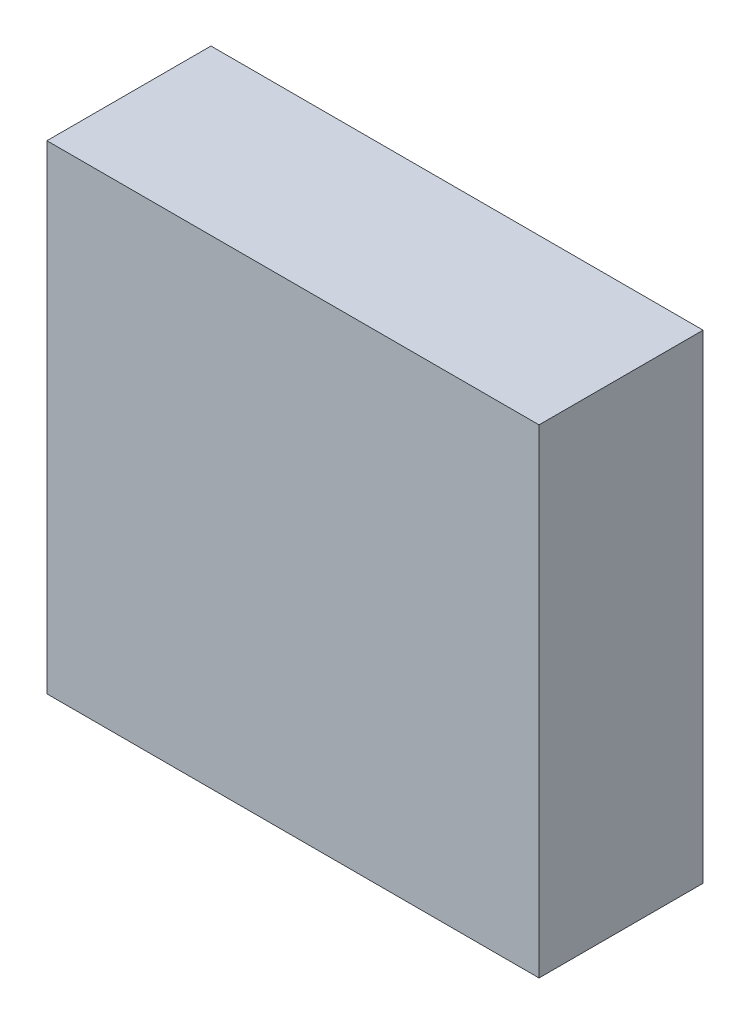
ISO-10303-21;
HEADER;
FILE_DESCRIPTION(('STEP AP214'),'2;1');
FILE_NAME('part.step','',(''),(''),'','','');
FILE_SCHEMA(('AUTOMOTIVE_DESIGN { 1 0 10303 214 1 1 1 1 }'));
ENDSEC;
DATA;
#1=APPLICATION_CONTEXT('core data for automotive mechanical design processes');
#2=APPLICATION_PROTOCOL_DEFINITION('international standard','automotive_design',2000,#1);
#3=PRODUCT_CONTEXT('',#1,'mechanical');
#4=PRODUCT('Part','Part','',(#3));
#5=PRODUCT_RELATED_PRODUCT_CATEGORY('part','',(#4));
#6=PRODUCT_DEFINITION_FORMATION('','',#4);
#7=PRODUCT_DEFINITION_CONTEXT('part definition',#1,'design');
#8=PRODUCT_DEFINITION('design','',#6,#7);
#9=PRODUCT_DEFINITION_SHAPE('','',#8);
#10=(LENGTH_UNIT() NAMED_UNIT(*) SI_UNIT(.MILLI.,.METRE.));
#11=(NAMED_UNIT(*) PLANE_ANGLE_UNIT() SI_UNIT($,.RADIAN.));
#12=(NAMED_UNIT(*) SI_UNIT($,.STERADIAN.) SOLID_ANGLE_UNIT());
#13=UNCERTAINTY_MEASURE_WITH_UNIT(LENGTH_MEASURE(1.E-05),#10,'distance_accuracy_value','');
#14=(GEOMETRIC_REPRESENTATION_CONTEXT(3) GLOBAL_UNCERTAINTY_ASSIGNED_CONTEXT((#13)) GLOBAL_UNIT_ASSIGNED_CONTEXT((#10,
#11,#12)) REPRESENTATION_CONTEXT('',''));
#15=CARTESIAN_POINT('',(0.,0.,0.));
#16=DIRECTION('',(0.,0.,1.));
#17=DIRECTION('',(1.,0.,0.));
#18=AXIS2_PLACEMENT_3D('',#15,#16,#17);
#19=CARTESIAN_POINT('',(15.113,3.048,1.6));
#20=DIRECTION('',(0.,0.,-1.));
#21=DIRECTION('',(0.,-1.,0.));
#22=AXIS2_PLACEMENT_3D('',#19,#20,#21);
#23=PLANE('',#22);
#24=DIRECTION('',(1.,0.,0.));
#25=VECTOR('',#24,1.);
#26=CARTESIAN_POINT('',(16.613,1.626,1.6));
#27=LINE('',#26,#25);
#28=CARTESIAN_POINT('',(13.613,1.626,1.6));
#29=VERTEX_POINT('',#28);
#30=CARTESIAN_POINT('',(16.613,1.626,1.6));
#31=VERTEX_POINT('',#30);
#32=EDGE_CURVE('E93',#29,#31,#27,.T.);
#33=ORIENTED_EDGE('',*,*,#32,.F.);
#34=DIRECTION('',(0.,-1.,0.));
#35=VECTOR('',#34,1.);
#36=CARTESIAN_POINT('',(13.613,1.626,1.6));
#37=LINE('',#36,#35);
#38=CARTESIAN_POINT('',(13.613,4.5462,1.6));
#39=VERTEX_POINT('',#38);
#40=EDGE_CURVE('E26',#39,#29,#37,.T.);
#41=ORIENTED_EDGE('',*,*,#40,.F.);
#42=DIRECTION('',(-1.,0.,0.));
#43=VECTOR('',#42,1.);
#44=CARTESIAN_POINT('',(13.613,4.5462,1.6));
#45=LINE('',#44,#43);
#46=CARTESIAN_POINT('',(16.613,4.5462,1.6));
#47=VERTEX_POINT('',#46);
#48=EDGE_CURVE('E83',#47,#39,#45,.T.);
#49=ORIENTED_EDGE('',*,*,#48,.F.);
#50=DIRECTION('',(0.,1.,0.));
#51=VECTOR('',#50,1.);
#52=CARTESIAN_POINT('',(16.613,4.5462,1.6));
#53=LINE('',#52,#51);
#54=EDGE_CURVE('E107',#31,#47,#53,.T.);
#55=ORIENTED_EDGE('',*,*,#54,.F.);
#56=EDGE_LOOP('',(#33,#41,#49,#55));
#57=FACE_BOUND('',#56,.T.);
#58=ADVANCED_FACE('F16',(#57),#23,.T.);
#59=CARTESIAN_POINT('',(15.113,3.048,2.6));
#60=DIRECTION('',(0.,0.,-1.));
#61=DIRECTION('',(0.,-1.,0.));
#62=AXIS2_PLACEMENT_3D('',#59,#60,#61);
#63=PLANE('',#62);
#64=DIRECTION('',(1.,0.,0.));
#65=VECTOR('',#64,1.);
#66=CARTESIAN_POINT('',(16.613,1.626,2.6));
#67=LINE('',#66,#65);
#68=CARTESIAN_POINT('',(13.613,1.626,2.6));
#69=VERTEX_POINT('',#68);
#70=CARTESIAN_POINT('',(16.613,1.626,2.6));
#71=VERTEX_POINT('',#70);
#72=EDGE_CURVE('E86',#69,#71,#67,.T.);
#73=ORIENTED_EDGE('',*,*,#72,.T.);
#74=DIRECTION('',(0.,1.,0.));
#75=VECTOR('',#74,1.);
#76=CARTESIAN_POINT('',(16.613,4.5462,2.6));
#77=LINE('',#76,#75);
#78=CARTESIAN_POINT('',(16.613,4.5462,2.6));
#79=VERTEX_POINT('',#78);
#80=EDGE_CURVE('E72',#71,#79,#77,.T.);
#81=ORIENTED_EDGE('',*,*,#80,.T.);
#82=DIRECTION('',(-1.,0.,0.));
#83=VECTOR('',#82,1.);
#84=CARTESIAN_POINT('',(13.613,4.5462,2.6));
#85=LINE('',#84,#83);
#86=CARTESIAN_POINT('',(13.613,4.5462,2.6));
#87=VERTEX_POINT('',#86);
#88=EDGE_CURVE('E104',#79,#87,#85,.T.);
#89=ORIENTED_EDGE('',*,*,#88,.T.);
#90=DIRECTION('',(0.,-1.,0.));
#91=VECTOR('',#90,1.);
#92=CARTESIAN_POINT('',(13.613,1.626,2.6));
#93=LINE('',#92,#91);
#94=EDGE_CURVE('E11',#87,#69,#93,.T.);
#95=ORIENTED_EDGE('',*,*,#94,.T.);
#96=EDGE_LOOP('',(#73,#81,#89,#95));
#97=FACE_BOUND('',#96,.T.);
#98=ADVANCED_FACE('F18',(#97),#63,.F.);
#99=CARTESIAN_POINT('',(13.613,1.626,2.6));
#100=DIRECTION('',(1.,0.,0.));
#101=DIRECTION('',(0.,-1.,0.));
#102=AXIS2_PLACEMENT_3D('',#99,#100,#101);
#103=PLANE('',#102);
#104=ORIENTED_EDGE('',*,*,#40,.T.);
#105=DIRECTION('',(0.,0.,-1.));
#106=VECTOR('',#105,1.);
#107=CARTESIAN_POINT('',(13.613,1.626,2.6));
#108=LINE('',#107,#106);
#109=EDGE_CURVE('E90',#69,#29,#108,.T.);
#110=ORIENTED_EDGE('',*,*,#109,.F.);
#111=ORIENTED_EDGE('',*,*,#94,.F.);
#112=DIRECTION('',(0.,0.,-1.));
#113=VECTOR('',#112,1.);
#114=CARTESIAN_POINT('',(13.613,4.5462,2.6));
#115=LINE('',#114,#113);
#116=EDGE_CURVE('E20',#87,#39,#115,.T.);
#117=ORIENTED_EDGE('',*,*,#116,.T.);
#118=EDGE_LOOP('',(#104,#110,#111,#117));
#119=FACE_BOUND('',#118,.T.);
#120=ADVANCED_FACE('F150',(#119),#103,.F.);
#121=CARTESIAN_POINT('',(13.613,4.5462,2.6));
#122=DIRECTION('',(0.,-1.,0.));
#123=DIRECTION('',(-1.,0.,0.));
#124=AXIS2_PLACEMENT_3D('',#121,#122,#123);
#125=PLANE('',#124);
#126=ORIENTED_EDGE('',*,*,#48,.T.);
#127=ORIENTED_EDGE('',*,*,#116,.F.);
#128=ORIENTED_EDGE('',*,*,#88,.F.);
#129=DIRECTION('',(0.,0.,-1.));
#130=VECTOR('',#129,1.);
#131=CARTESIAN_POINT('',(16.613,4.5462,2.6));
#132=LINE('',#131,#130);
#133=EDGE_CURVE('E80',#79,#47,#132,.T.);
#134=ORIENTED_EDGE('',*,*,#133,.T.);
#135=EDGE_LOOP('',(#126,#127,#128,#134));
#136=FACE_BOUND('',#135,.T.);
#137=ADVANCED_FACE('F117',(#136),#125,.F.);
#138=CARTESIAN_POINT('',(16.613,4.5462,2.6));
#139=DIRECTION('',(-1.,0.,0.));
#140=DIRECTION('',(0.,0.,1.));
#141=AXIS2_PLACEMENT_3D('',#138,#139,#140);
#142=PLANE('',#141);
#143=ORIENTED_EDGE('',*,*,#54,.T.);
#144=ORIENTED_EDGE('',*,*,#133,.F.);
#145=ORIENTED_EDGE('',*,*,#80,.F.);
#146=DIRECTION('',(0.,0.,-1.));
#147=VECTOR('',#146,1.);
#148=CARTESIAN_POINT('',(16.613,1.626,2.6));
#149=LINE('',#148,#147);
#150=EDGE_CURVE('E77',#71,#31,#149,.T.);
#151=ORIENTED_EDGE('',*,*,#150,.T.);
#152=EDGE_LOOP('',(#143,#144,#145,#151));
#153=FACE_BOUND('',#152,.T.);
#154=ADVANCED_FACE('F75',(#153),#142,.F.);
#155=CARTESIAN_POINT('',(16.613,1.626,2.6));
#156=DIRECTION('',(0.,1.,0.));
#157=DIRECTION('',(1.,0.,0.));
#158=AXIS2_PLACEMENT_3D('',#155,#156,#157);
#159=PLANE('',#158);
#160=ORIENTED_EDGE('',*,*,#32,.T.);
#161=ORIENTED_EDGE('',*,*,#150,.F.);
#162=ORIENTED_EDGE('',*,*,#72,.F.);
#163=ORIENTED_EDGE('',*,*,#109,.T.);
#164=EDGE_LOOP('',(#160,#161,#162,#163));
#165=FACE_BOUND('',#164,.T.);
#166=ADVANCED_FACE('F92',(#165),#159,.F.);
#167=CLOSED_SHELL('',(#58,#98,#120,#137,#154,#166));
#168=MANIFOLD_SOLID_BREP('B1',#167);
#169=ADVANCED_BREP_SHAPE_REPRESENTATION('',(#18,#168),#14);
#170=SHAPE_DEFINITION_REPRESENTATION(#9,#169);
ENDSEC;
END-ISO-10303-21;
